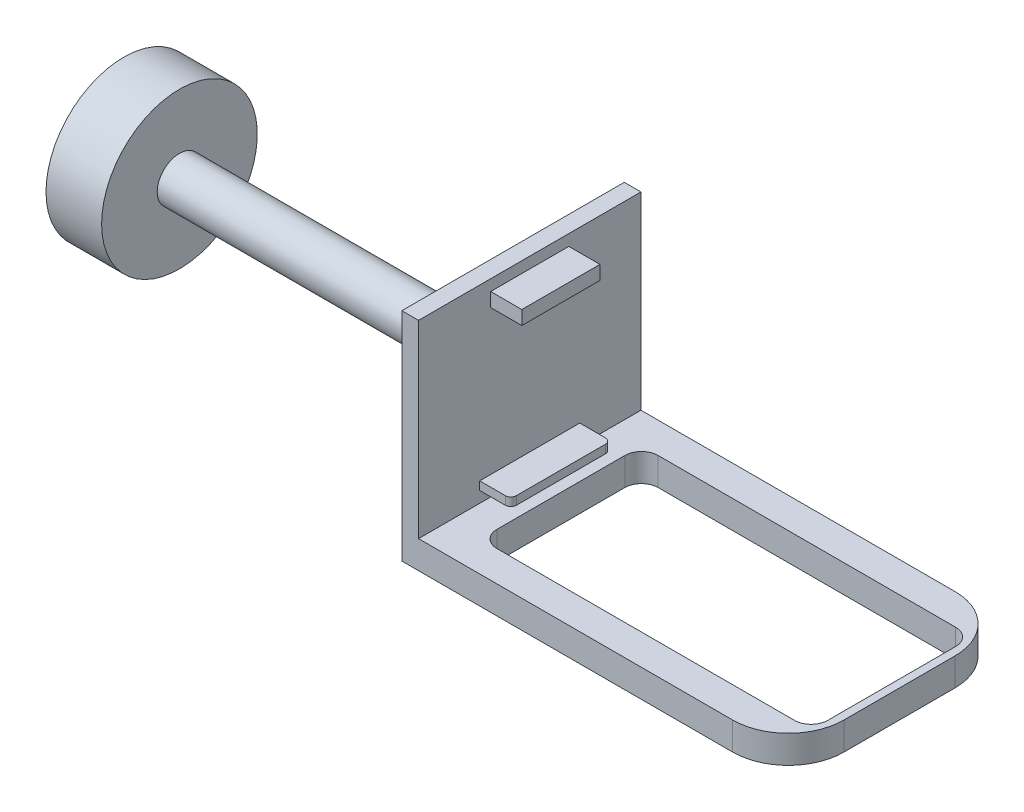
ISO-10303-21;
HEADER;
FILE_DESCRIPTION(('STEP AP214'),'2;1');
FILE_NAME('part.step','',(''),(''),'','','');
FILE_SCHEMA(('AUTOMOTIVE_DESIGN { 1 0 10303 214 1 1 1 1 }'));
ENDSEC;
DATA;
#1=APPLICATION_CONTEXT('core data for automotive mechanical design processes');
#2=APPLICATION_PROTOCOL_DEFINITION('international standard','automotive_design',2000,#1);
#3=PRODUCT_CONTEXT('',#1,'mechanical');
#4=PRODUCT('Part','Part','',(#3));
#5=PRODUCT_RELATED_PRODUCT_CATEGORY('part','',(#4));
#6=PRODUCT_DEFINITION_FORMATION('','',#4);
#7=PRODUCT_DEFINITION_CONTEXT('part definition',#1,'design');
#8=PRODUCT_DEFINITION('design','',#6,#7);
#9=PRODUCT_DEFINITION_SHAPE('','',#8);
#10=(LENGTH_UNIT() NAMED_UNIT(*) SI_UNIT(.MILLI.,.METRE.));
#11=(NAMED_UNIT(*) PLANE_ANGLE_UNIT() SI_UNIT($,.RADIAN.));
#12=(NAMED_UNIT(*) SI_UNIT($,.STERADIAN.) SOLID_ANGLE_UNIT());
#13=UNCERTAINTY_MEASURE_WITH_UNIT(LENGTH_MEASURE(1.E-05),#10,'distance_accuracy_value','');
#14=(GEOMETRIC_REPRESENTATION_CONTEXT(3) GLOBAL_UNCERTAINTY_ASSIGNED_CONTEXT((#13)) GLOBAL_UNIT_ASSIGNED_CONTEXT((#10,
#11,#12)) REPRESENTATION_CONTEXT('',''));
#15=CARTESIAN_POINT('',(0.,0.,0.));
#16=DIRECTION('',(0.,0.,1.));
#17=DIRECTION('',(1.,0.,0.));
#18=AXIS2_PLACEMENT_3D('',#15,#16,#17);
#19=CARTESIAN_POINT('',(-33.25,0.,0.));
#20=DIRECTION('',(-1.,0.,0.));
#21=DIRECTION('',(0.,0.,1.));
#22=AXIS2_PLACEMENT_3D('',#19,#20,#21);
#23=PLANE('',#22);
#24=DIRECTION('',(0.,-1.,0.));
#25=VECTOR('',#24,1.);
#26=CARTESIAN_POINT('',(-33.25,37.,7.025));
#27=LINE('',#26,#25);
#28=CARTESIAN_POINT('',(-33.25,37.,7.025));
#29=VERTEX_POINT('',#28);
#30=CARTESIAN_POINT('',(-33.25,34.5,7.025));
#31=VERTEX_POINT('',#30);
#32=EDGE_CURVE('E236',#29,#31,#27,.T.);
#33=ORIENTED_EDGE('',*,*,#32,.F.);
#34=DIRECTION('',(0.,0.,1.));
#35=VECTOR('',#34,1.);
#36=CARTESIAN_POINT('',(-33.25,37.,0.));
#37=LINE('',#36,#35);
#38=CARTESIAN_POINT('',(-33.25,37.,-7.025));
#39=VERTEX_POINT('',#38);
#40=EDGE_CURVE('E252',#39,#29,#37,.T.);
#41=ORIENTED_EDGE('',*,*,#40,.F.);
#42=DIRECTION('',(0.,1.,0.));
#43=VECTOR('',#42,1.);
#44=CARTESIAN_POINT('',(-33.25,34.5,-7.025));
#45=LINE('',#44,#43);
#46=CARTESIAN_POINT('',(-33.25,34.5,-7.025));
#47=VERTEX_POINT('',#46);
#48=EDGE_CURVE('E262',#47,#39,#45,.T.);
#49=ORIENTED_EDGE('',*,*,#48,.F.);
#50=DIRECTION('',(0.,0.,-1.));
#51=VECTOR('',#50,1.);
#52=CARTESIAN_POINT('',(-33.25,34.5,7.025));
#53=LINE('',#52,#51);
#54=EDGE_CURVE('E240',#31,#47,#53,.T.);
#55=ORIENTED_EDGE('',*,*,#54,.F.);
#56=EDGE_LOOP('',(#33,#41,#49,#55));
#57=FACE_BOUND('',#56,.T.);
#58=DIRECTION('',(0.,0.,1.));
#59=VECTOR('',#58,1.);
#60=CARTESIAN_POINT('',(-33.25,5.,20.));
#61=LINE('',#60,#59);
#62=CARTESIAN_POINT('',(-33.25,5.,-20.));
#63=VERTEX_POINT('',#62);
#64=CARTESIAN_POINT('',(-33.25,5.,20.));
#65=VERTEX_POINT('',#64);
#66=EDGE_CURVE('E367',#63,#65,#61,.T.);
#67=ORIENTED_EDGE('',*,*,#66,.F.);
#68=DIRECTION('',(0.,-1.,0.));
#69=VECTOR('',#68,1.);
#70=CARTESIAN_POINT('',(-33.25,0.,-20.));
#71=LINE('',#70,#69);
#72=CARTESIAN_POINT('',(-33.25,39.,-20.));
#73=VERTEX_POINT('',#72);
#74=EDGE_CURVE('E283',#73,#63,#71,.T.);
#75=ORIENTED_EDGE('',*,*,#74,.F.);
#76=DIRECTION('',(0.,0.,-1.));
#77=VECTOR('',#76,1.);
#78=CARTESIAN_POINT('',(-33.25,39.,20.));
#79=LINE('',#78,#77);
#80=CARTESIAN_POINT('',(-33.25,39.,20.));
#81=VERTEX_POINT('',#80);
#82=EDGE_CURVE('E293',#81,#73,#79,.T.);
#83=ORIENTED_EDGE('',*,*,#82,.F.);
#84=DIRECTION('',(0.,1.,0.));
#85=VECTOR('',#84,1.);
#86=CARTESIAN_POINT('',(-33.25,0.,20.));
#87=LINE('',#86,#85);
#88=EDGE_CURVE('E278',#65,#81,#87,.T.);
#89=ORIENTED_EDGE('',*,*,#88,.F.);
#90=EDGE_LOOP('',(#67,#75,#83,#89));
#91=FACE_BOUND('',#90,.T.);
#92=DIRECTION('',(0.,0.,-1.));
#93=VECTOR('',#92,1.);
#94=CARTESIAN_POINT('',(-33.25,7.,0.));
#95=LINE('',#94,#93);
#96=CARTESIAN_POINT('',(-33.25,7.,9.));
#97=VERTEX_POINT('',#96);
#98=CARTESIAN_POINT('',(-33.25,7.,-9.));
#99=VERTEX_POINT('',#98);
#100=EDGE_CURVE('E216',#97,#99,#95,.T.);
#101=ORIENTED_EDGE('',*,*,#100,.F.);
#102=DIRECTION('',(0.,-1.,0.));
#103=VECTOR('',#102,1.);
#104=CARTESIAN_POINT('',(-33.25,8.5,9.));
#105=LINE('',#104,#103);
#106=CARTESIAN_POINT('',(-33.25,8.5,9.));
#107=VERTEX_POINT('',#106);
#108=EDGE_CURVE('E228',#107,#97,#105,.T.);
#109=ORIENTED_EDGE('',*,*,#108,.F.);
#110=DIRECTION('',(0.,0.,1.));
#111=VECTOR('',#110,1.);
#112=CARTESIAN_POINT('',(-33.25,8.5,-9.));
#113=LINE('',#112,#111);
#114=CARTESIAN_POINT('',(-33.25,8.5,-9.));
#115=VERTEX_POINT('',#114);
#116=EDGE_CURVE('E237',#115,#107,#113,.T.);
#117=ORIENTED_EDGE('',*,*,#116,.F.);
#118=DIRECTION('',(0.,1.,0.));
#119=VECTOR('',#118,1.);
#120=CARTESIAN_POINT('',(-33.25,7.,-9.));
#121=LINE('',#120,#119);
#122=EDGE_CURVE('E231',#99,#115,#121,.T.);
#123=ORIENTED_EDGE('',*,*,#122,.F.);
#124=EDGE_LOOP('',(#101,#109,#117,#123));
#125=FACE_BOUND('',#124,.T.);
#126=ADVANCED_FACE('F35',(#57,#91,#125),#23,.F.);
#127=CARTESIAN_POINT('',(0.,5.,0.));
#128=DIRECTION('',(0.,-1.,0.));
#129=DIRECTION('',(0.,0.,-1.));
#130=AXIS2_PLACEMENT_3D('',#127,#128,#129);
#131=PLANE('',#130);
#132=DIRECTION('',(1.,0.,0.));
#133=VECTOR('',#132,1.);
#134=CARTESIAN_POINT('',(-33.25,5.,20.));
#135=LINE('',#134,#133);
#136=CARTESIAN_POINT('',(23.25,5.,20.));
#137=VERTEX_POINT('',#136);
#138=EDGE_CURVE('E370',#65,#137,#135,.T.);
#139=ORIENTED_EDGE('',*,*,#138,.T.);
#140=CARTESIAN_POINT('',(23.25,5.,10.));
#141=DIRECTION('',(0.,-1.,0.));
#142=DIRECTION('',(0.,0.,-1.));
#143=AXIS2_PLACEMENT_3D('',#140,#141,#142);
#144=CIRCLE('',#143,10.);
#145=CARTESIAN_POINT('',(33.25,5.,10.));
#146=VERTEX_POINT('',#145);
#147=EDGE_CURVE('E43',#137,#146,#144,.F.);
#148=ORIENTED_EDGE('',*,*,#147,.T.);
#149=DIRECTION('',(0.,0.,-1.));
#150=VECTOR('',#149,1.);
#151=CARTESIAN_POINT('',(33.25,5.,20.));
#152=LINE('',#151,#150);
#153=CARTESIAN_POINT('',(33.25,5.,-10.));
#154=VERTEX_POINT('',#153);
#155=EDGE_CURVE('E362',#146,#154,#152,.T.);
#156=ORIENTED_EDGE('',*,*,#155,.T.);
#157=CARTESIAN_POINT('',(23.25,5.,-10.));
#158=DIRECTION('',(0.,-1.,0.));
#159=DIRECTION('',(0.,0.,-1.));
#160=AXIS2_PLACEMENT_3D('',#157,#158,#159);
#161=CIRCLE('',#160,10.);
#162=CARTESIAN_POINT('',(23.25,5.,-20.));
#163=VERTEX_POINT('',#162);
#164=EDGE_CURVE('E50',#154,#163,#161,.F.);
#165=ORIENTED_EDGE('',*,*,#164,.T.);
#166=DIRECTION('',(-1.,0.,0.));
#167=VECTOR('',#166,1.);
#168=CARTESIAN_POINT('',(-33.25,5.,-20.));
#169=LINE('',#168,#167);
#170=EDGE_CURVE('E364',#163,#63,#169,.T.);
#171=ORIENTED_EDGE('',*,*,#170,.T.);
#172=ORIENTED_EDGE('',*,*,#66,.T.);
#173=EDGE_LOOP('',(#139,#148,#156,#165,#171,#172));
#174=FACE_BOUND('',#173,.T.);
#175=CARTESIAN_POINT('',(28.85,5.,11.5));
#176=DIRECTION('',(0.,1.,0.));
#177=DIRECTION('',(0.,0.,-1.));
#178=AXIS2_PLACEMENT_3D('',#175,#176,#177);
#179=CIRCLE('',#178,3.);
#180=CARTESIAN_POINT('',(28.85,5.,14.5));
#181=VERTEX_POINT('',#180);
#182=CARTESIAN_POINT('',(31.85,5.,11.5));
#183=VERTEX_POINT('',#182);
#184=EDGE_CURVE('E303',#181,#183,#179,.T.);
#185=ORIENTED_EDGE('',*,*,#184,.F.);
#186=DIRECTION('',(1.,0.,0.));
#187=VECTOR('',#186,1.);
#188=CARTESIAN_POINT('',(28.85,5.,14.5));
#189=LINE('',#188,#187);
#190=CARTESIAN_POINT('',(-24.65,5.,14.5));
#191=VERTEX_POINT('',#190);
#192=EDGE_CURVE('E319',#191,#181,#189,.T.);
#193=ORIENTED_EDGE('',*,*,#192,.F.);
#194=CARTESIAN_POINT('',(-24.65,5.,11.5));
#195=DIRECTION('',(0.,1.,0.));
#196=DIRECTION('',(0.,0.,1.));
#197=AXIS2_PLACEMENT_3D('',#194,#195,#196);
#198=CIRCLE('',#197,3.);
#199=CARTESIAN_POINT('',(-27.65,5.,11.5));
#200=VERTEX_POINT('',#199);
#201=EDGE_CURVE('E316',#200,#191,#198,.T.);
#202=ORIENTED_EDGE('',*,*,#201,.F.);
#203=DIRECTION('',(0.,0.,1.));
#204=VECTOR('',#203,1.);
#205=CARTESIAN_POINT('',(-27.65,5.,-11.5));
#206=LINE('',#205,#204);
#207=CARTESIAN_POINT('',(-27.65,5.,-11.5));
#208=VERTEX_POINT('',#207);
#209=EDGE_CURVE('E314',#208,#200,#206,.T.);
#210=ORIENTED_EDGE('',*,*,#209,.F.);
#211=CARTESIAN_POINT('',(-24.65,5.,-11.5));
#212=DIRECTION('',(0.,1.,0.));
#213=DIRECTION('',(0.,0.,-1.));
#214=AXIS2_PLACEMENT_3D('',#211,#212,#213);
#215=CIRCLE('',#214,3.);
#216=CARTESIAN_POINT('',(-24.65,5.,-14.5));
#217=VERTEX_POINT('',#216);
#218=EDGE_CURVE('E312',#217,#208,#215,.T.);
#219=ORIENTED_EDGE('',*,*,#218,.F.);
#220=DIRECTION('',(-1.,0.,0.));
#221=VECTOR('',#220,1.);
#222=CARTESIAN_POINT('',(-24.65,5.,-14.5));
#223=LINE('',#222,#221);
#224=CARTESIAN_POINT('',(28.85,5.,-14.5));
#225=VERTEX_POINT('',#224);
#226=EDGE_CURVE('E310',#225,#217,#223,.T.);
#227=ORIENTED_EDGE('',*,*,#226,.F.);
#228=CARTESIAN_POINT('',(28.85,5.,-11.5));
#229=DIRECTION('',(0.,1.,0.));
#230=DIRECTION('',(0.,0.,-1.));
#231=AXIS2_PLACEMENT_3D('',#228,#229,#230);
#232=CIRCLE('',#231,3.);
#233=CARTESIAN_POINT('',(31.85,5.,-11.5));
#234=VERTEX_POINT('',#233);
#235=EDGE_CURVE('E308',#234,#225,#232,.T.);
#236=ORIENTED_EDGE('',*,*,#235,.F.);
#237=DIRECTION('',(0.,0.,-1.));
#238=VECTOR('',#237,1.);
#239=CARTESIAN_POINT('',(31.85,5.,-11.5));
#240=LINE('',#239,#238);
#241=EDGE_CURVE('E305',#183,#234,#240,.T.);
#242=ORIENTED_EDGE('',*,*,#241,.F.);
#243=EDGE_LOOP('',(#185,#193,#202,#210,#219,#227,#236,#242));
#244=FACE_BOUND('',#243,.T.);
#245=ADVANCED_FACE('F406',(#174,#244),#131,.F.);
#246=CARTESIAN_POINT('',(0.,0.,0.));
#247=DIRECTION('',(0.,-1.,0.));
#248=DIRECTION('',(0.,0.,-1.));
#249=AXIS2_PLACEMENT_3D('',#246,#247,#248);
#250=PLANE('',#249);
#251=DIRECTION('',(0.,0.,-1.));
#252=VECTOR('',#251,1.);
#253=CARTESIAN_POINT('',(33.25,0.,20.));
#254=LINE('',#253,#252);
#255=CARTESIAN_POINT('',(33.25,0.,10.));
#256=VERTEX_POINT('',#255);
#257=CARTESIAN_POINT('',(33.25,0.,-10.));
#258=VERTEX_POINT('',#257);
#259=EDGE_CURVE('E361',#256,#258,#254,.T.);
#260=ORIENTED_EDGE('',*,*,#259,.F.);
#261=CARTESIAN_POINT('',(23.25,0.,10.));
#262=DIRECTION('',(0.,-1.,0.));
#263=DIRECTION('',(0.,0.,-1.));
#264=AXIS2_PLACEMENT_3D('',#261,#262,#263);
#265=CIRCLE('',#264,10.);
#266=CARTESIAN_POINT('',(23.25,0.,20.));
#267=VERTEX_POINT('',#266);
#268=EDGE_CURVE('E401',#256,#267,#265,.T.);
#269=ORIENTED_EDGE('',*,*,#268,.T.);
#270=DIRECTION('',(1.,0.,0.));
#271=VECTOR('',#270,1.);
#272=CARTESIAN_POINT('',(-33.25,0.,20.));
#273=LINE('',#272,#271);
#274=CARTESIAN_POINT('',(-36.25,0.,20.));
#275=VERTEX_POINT('',#274);
#276=EDGE_CURVE('E365',#275,#267,#273,.T.);
#277=ORIENTED_EDGE('',*,*,#276,.F.);
#278=DIRECTION('',(0.,0.,1.));
#279=VECTOR('',#278,1.);
#280=CARTESIAN_POINT('',(-36.25,0.,20.));
#281=LINE('',#280,#279);
#282=CARTESIAN_POINT('',(-36.25,0.,-20.));
#283=VERTEX_POINT('',#282);
#284=EDGE_CURVE('E288',#283,#275,#281,.T.);
#285=ORIENTED_EDGE('',*,*,#284,.F.);
#286=DIRECTION('',(-1.,0.,0.));
#287=VECTOR('',#286,1.);
#288=CARTESIAN_POINT('',(-33.25,0.,-20.));
#289=LINE('',#288,#287);
#290=CARTESIAN_POINT('',(23.25,0.,-20.));
#291=VERTEX_POINT('',#290);
#292=EDGE_CURVE('E375',#291,#283,#289,.T.);
#293=ORIENTED_EDGE('',*,*,#292,.F.);
#294=CARTESIAN_POINT('',(23.25,0.,-10.));
#295=DIRECTION('',(0.,-1.,0.));
#296=DIRECTION('',(0.,0.,-1.));
#297=AXIS2_PLACEMENT_3D('',#294,#295,#296);
#298=CIRCLE('',#297,10.);
#299=EDGE_CURVE('E399',#291,#258,#298,.T.);
#300=ORIENTED_EDGE('',*,*,#299,.T.);
#301=EDGE_LOOP('',(#260,#269,#277,#285,#293,#300));
#302=FACE_BOUND('',#301,.T.);
#303=DIRECTION('',(1.,0.,0.));
#304=VECTOR('',#303,1.);
#305=CARTESIAN_POINT('',(28.85,0.,14.5));
#306=LINE('',#305,#304);
#307=CARTESIAN_POINT('',(-24.65,0.,14.5));
#308=VERTEX_POINT('',#307);
#309=CARTESIAN_POINT('',(28.85,0.,14.5));
#310=VERTEX_POINT('',#309);
#311=EDGE_CURVE('E306',#308,#310,#306,.T.);
#312=ORIENTED_EDGE('',*,*,#311,.T.);
#313=CARTESIAN_POINT('',(28.85,0.,11.5));
#314=DIRECTION('',(0.,1.,0.));
#315=DIRECTION('',(0.,0.,-1.));
#316=AXIS2_PLACEMENT_3D('',#313,#314,#315);
#317=CIRCLE('',#316,3.);
#318=CARTESIAN_POINT('',(31.85,0.,11.5));
#319=VERTEX_POINT('',#318);
#320=EDGE_CURVE('E302',#310,#319,#317,.T.);
#321=ORIENTED_EDGE('',*,*,#320,.T.);
#322=DIRECTION('',(0.,0.,-1.));
#323=VECTOR('',#322,1.);
#324=CARTESIAN_POINT('',(31.85,0.,-11.5));
#325=LINE('',#324,#323);
#326=CARTESIAN_POINT('',(31.85,0.,-11.5));
#327=VERTEX_POINT('',#326);
#328=EDGE_CURVE('E324',#319,#327,#325,.T.);
#329=ORIENTED_EDGE('',*,*,#328,.T.);
#330=CARTESIAN_POINT('',(28.85,0.,-11.5));
#331=DIRECTION('',(0.,1.,0.));
#332=DIRECTION('',(0.,0.,-1.));
#333=AXIS2_PLACEMENT_3D('',#330,#331,#332);
#334=CIRCLE('',#333,3.);
#335=CARTESIAN_POINT('',(28.85,0.,-14.5));
#336=VERTEX_POINT('',#335);
#337=EDGE_CURVE('E327',#327,#336,#334,.T.);
#338=ORIENTED_EDGE('',*,*,#337,.T.);
#339=DIRECTION('',(-1.,0.,0.));
#340=VECTOR('',#339,1.);
#341=CARTESIAN_POINT('',(-24.65,0.,-14.5));
#342=LINE('',#341,#340);
#343=CARTESIAN_POINT('',(-24.65,0.,-14.5));
#344=VERTEX_POINT('',#343);
#345=EDGE_CURVE('E330',#336,#344,#342,.T.);
#346=ORIENTED_EDGE('',*,*,#345,.T.);
#347=CARTESIAN_POINT('',(-24.65,0.,-11.5));
#348=DIRECTION('',(0.,1.,0.));
#349=DIRECTION('',(0.,0.,-1.));
#350=AXIS2_PLACEMENT_3D('',#347,#348,#349);
#351=CIRCLE('',#350,3.);
#352=CARTESIAN_POINT('',(-27.65,0.,-11.5));
#353=VERTEX_POINT('',#352);
#354=EDGE_CURVE('E333',#344,#353,#351,.T.);
#355=ORIENTED_EDGE('',*,*,#354,.T.);
#356=DIRECTION('',(0.,0.,1.));
#357=VECTOR('',#356,1.);
#358=CARTESIAN_POINT('',(-27.65,0.,-11.5));
#359=LINE('',#358,#357);
#360=CARTESIAN_POINT('',(-27.65,0.,11.5));
#361=VERTEX_POINT('',#360);
#362=EDGE_CURVE('E336',#353,#361,#359,.T.);
#363=ORIENTED_EDGE('',*,*,#362,.T.);
#364=CARTESIAN_POINT('',(-24.65,0.,11.5));
#365=DIRECTION('',(0.,1.,0.));
#366=DIRECTION('',(0.,0.,1.));
#367=AXIS2_PLACEMENT_3D('',#364,#365,#366);
#368=CIRCLE('',#367,3.);
#369=EDGE_CURVE('E339',#361,#308,#368,.T.);
#370=ORIENTED_EDGE('',*,*,#369,.T.);
#371=EDGE_LOOP('',(#312,#321,#329,#338,#346,#355,#363,#370));
#372=FACE_BOUND('',#371,.T.);
#373=ADVANCED_FACE('F416',(#302,#372),#250,.T.);
#374=CARTESIAN_POINT('',(33.25,5.,20.));
#375=DIRECTION('',(-1.,0.,0.));
#376=DIRECTION('',(0.,0.,1.));
#377=AXIS2_PLACEMENT_3D('',#374,#375,#376);
#378=PLANE('',#377);
#379=ORIENTED_EDGE('',*,*,#155,.F.);
#380=DIRECTION('',(0.,-1.,0.));
#381=VECTOR('',#380,1.);
#382=CARTESIAN_POINT('',(33.25,5.,10.));
#383=LINE('',#382,#381);
#384=EDGE_CURVE('E396',#146,#256,#383,.T.);
#385=ORIENTED_EDGE('',*,*,#384,.T.);
#386=ORIENTED_EDGE('',*,*,#259,.T.);
#387=DIRECTION('',(0.,-1.,0.));
#388=VECTOR('',#387,1.);
#389=CARTESIAN_POINT('',(33.25,5.,-10.));
#390=LINE('',#389,#388);
#391=EDGE_CURVE('E394',#258,#154,#390,.F.);
#392=ORIENTED_EDGE('',*,*,#391,.T.);
#393=EDGE_LOOP('',(#379,#385,#386,#392));
#394=FACE_BOUND('',#393,.T.);
#395=ADVANCED_FACE('F411',(#394),#378,.F.);
#396=CARTESIAN_POINT('',(-33.25,5.,-20.));
#397=DIRECTION('',(0.,0.,1.));
#398=DIRECTION('',(1.,0.,0.));
#399=AXIS2_PLACEMENT_3D('',#396,#397,#398);
#400=PLANE('',#399);
#401=ORIENTED_EDGE('',*,*,#170,.F.);
#402=DIRECTION('',(0.,-1.,0.));
#403=VECTOR('',#402,1.);
#404=CARTESIAN_POINT('',(23.25,5.,-20.));
#405=LINE('',#404,#403);
#406=EDGE_CURVE('E11',#163,#291,#405,.T.);
#407=ORIENTED_EDGE('',*,*,#406,.T.);
#408=ORIENTED_EDGE('',*,*,#292,.T.);
#409=DIRECTION('',(0.,-1.,0.));
#410=VECTOR('',#409,1.);
#411=CARTESIAN_POINT('',(-36.25,0.,-20.));
#412=LINE('',#411,#410);
#413=CARTESIAN_POINT('',(-36.25,39.,-20.));
#414=VERTEX_POINT('',#413);
#415=EDGE_CURVE('E285',#414,#283,#412,.T.);
#416=ORIENTED_EDGE('',*,*,#415,.F.);
#417=DIRECTION('',(1.,0.,0.));
#418=VECTOR('',#417,1.);
#419=CARTESIAN_POINT('',(-36.25,39.,-20.));
#420=LINE('',#419,#418);
#421=EDGE_CURVE('E291',#414,#73,#420,.T.);
#422=ORIENTED_EDGE('',*,*,#421,.T.);
#423=ORIENTED_EDGE('',*,*,#74,.T.);
#424=EDGE_LOOP('',(#401,#407,#408,#416,#422,#423));
#425=FACE_BOUND('',#424,.T.);
#426=ADVANCED_FACE('F428',(#425),#400,.F.);
#427=CARTESIAN_POINT('',(-33.25,5.,20.));
#428=DIRECTION('',(0.,0.,-1.));
#429=DIRECTION('',(-1.,0.,0.));
#430=AXIS2_PLACEMENT_3D('',#427,#428,#429);
#431=PLANE('',#430);
#432=ORIENTED_EDGE('',*,*,#276,.T.);
#433=DIRECTION('',(0.,-1.,0.));
#434=VECTOR('',#433,1.);
#435=CARTESIAN_POINT('',(23.25,5.,20.));
#436=LINE('',#435,#434);
#437=EDGE_CURVE('E58',#267,#137,#436,.F.);
#438=ORIENTED_EDGE('',*,*,#437,.T.);
#439=ORIENTED_EDGE('',*,*,#138,.F.);
#440=ORIENTED_EDGE('',*,*,#88,.T.);
#441=DIRECTION('',(1.,0.,0.));
#442=VECTOR('',#441,1.);
#443=CARTESIAN_POINT('',(-36.25,39.,20.));
#444=LINE('',#443,#442);
#445=CARTESIAN_POINT('',(-36.25,39.,20.));
#446=VERTEX_POINT('',#445);
#447=EDGE_CURVE('E299',#446,#81,#444,.T.);
#448=ORIENTED_EDGE('',*,*,#447,.F.);
#449=DIRECTION('',(0.,1.,0.));
#450=VECTOR('',#449,1.);
#451=CARTESIAN_POINT('',(-36.25,0.,20.));
#452=LINE('',#451,#450);
#453=EDGE_CURVE('E279',#275,#446,#452,.T.);
#454=ORIENTED_EDGE('',*,*,#453,.F.);
#455=EDGE_LOOP('',(#432,#438,#439,#440,#448,#454));
#456=FACE_BOUND('',#455,.T.);
#457=ADVANCED_FACE('F420',(#456),#431,.F.);
#458=CARTESIAN_POINT('',(28.85,5.,11.5));
#459=DIRECTION('',(0.,-1.,0.));
#460=DIRECTION('',(0.,0.,-1.));
#461=AXIS2_PLACEMENT_3D('',#458,#459,#460);
#462=CYLINDRICAL_SURFACE('',#461,3.);
#463=ORIENTED_EDGE('',*,*,#320,.F.);
#464=DIRECTION('',(0.,-1.,0.));
#465=VECTOR('',#464,1.);
#466=CARTESIAN_POINT('',(28.85,5.,14.5));
#467=LINE('',#466,#465);
#468=EDGE_CURVE('E321',#181,#310,#467,.T.);
#469=ORIENTED_EDGE('',*,*,#468,.F.);
#470=ORIENTED_EDGE('',*,*,#184,.T.);
#471=DIRECTION('',(0.,-1.,0.));
#472=VECTOR('',#471,1.);
#473=CARTESIAN_POINT('',(31.85,5.,11.5));
#474=LINE('',#473,#472);
#475=EDGE_CURVE('E358',#183,#319,#474,.T.);
#476=ORIENTED_EDGE('',*,*,#475,.T.);
#477=EDGE_LOOP('',(#463,#469,#470,#476));
#478=FACE_BOUND('',#477,.T.);
#479=ADVANCED_FACE('F484',(#478),#462,.F.);
#480=CARTESIAN_POINT('',(31.85,5.,-11.5));
#481=DIRECTION('',(-1.,0.,0.));
#482=DIRECTION('',(0.,0.,1.));
#483=AXIS2_PLACEMENT_3D('',#480,#481,#482);
#484=PLANE('',#483);
#485=ORIENTED_EDGE('',*,*,#328,.F.);
#486=ORIENTED_EDGE('',*,*,#475,.F.);
#487=ORIENTED_EDGE('',*,*,#241,.T.);
#488=DIRECTION('',(0.,-1.,0.));
#489=VECTOR('',#488,1.);
#490=CARTESIAN_POINT('',(31.85,5.,-11.5));
#491=LINE('',#490,#489);
#492=EDGE_CURVE('E356',#234,#327,#491,.T.);
#493=ORIENTED_EDGE('',*,*,#492,.T.);
#494=EDGE_LOOP('',(#485,#486,#487,#493));
#495=FACE_BOUND('',#494,.T.);
#496=ADVANCED_FACE('F480',(#495),#484,.T.);
#497=CARTESIAN_POINT('',(28.85,5.,-11.5));
#498=DIRECTION('',(0.,-1.,0.));
#499=DIRECTION('',(0.,0.,-1.));
#500=AXIS2_PLACEMENT_3D('',#497,#498,#499);
#501=CYLINDRICAL_SURFACE('',#500,3.);
#502=ORIENTED_EDGE('',*,*,#337,.F.);
#503=ORIENTED_EDGE('',*,*,#492,.F.);
#504=ORIENTED_EDGE('',*,*,#235,.T.);
#505=DIRECTION('',(0.,-1.,0.));
#506=VECTOR('',#505,1.);
#507=CARTESIAN_POINT('',(28.85,5.,-14.5));
#508=LINE('',#507,#506);
#509=EDGE_CURVE('E354',#225,#336,#508,.T.);
#510=ORIENTED_EDGE('',*,*,#509,.T.);
#511=EDGE_LOOP('',(#502,#503,#504,#510));
#512=FACE_BOUND('',#511,.T.);
#513=ADVANCED_FACE('F476',(#512),#501,.F.);
#514=CARTESIAN_POINT('',(-24.65,5.,-14.5));
#515=DIRECTION('',(0.,0.,1.));
#516=DIRECTION('',(1.,0.,0.));
#517=AXIS2_PLACEMENT_3D('',#514,#515,#516);
#518=PLANE('',#517);
#519=ORIENTED_EDGE('',*,*,#345,.F.);
#520=ORIENTED_EDGE('',*,*,#509,.F.);
#521=ORIENTED_EDGE('',*,*,#226,.T.);
#522=DIRECTION('',(0.,-1.,0.));
#523=VECTOR('',#522,1.);
#524=CARTESIAN_POINT('',(-24.65,5.,-14.5));
#525=LINE('',#524,#523);
#526=EDGE_CURVE('E352',#217,#344,#525,.T.);
#527=ORIENTED_EDGE('',*,*,#526,.T.);
#528=EDGE_LOOP('',(#519,#520,#521,#527));
#529=FACE_BOUND('',#528,.T.);
#530=ADVANCED_FACE('F472',(#529),#518,.T.);
#531=CARTESIAN_POINT('',(-24.65,5.,-11.5));
#532=DIRECTION('',(0.,-1.,0.));
#533=DIRECTION('',(0.,0.,-1.));
#534=AXIS2_PLACEMENT_3D('',#531,#532,#533);
#535=CYLINDRICAL_SURFACE('',#534,3.);
#536=ORIENTED_EDGE('',*,*,#354,.F.);
#537=ORIENTED_EDGE('',*,*,#526,.F.);
#538=ORIENTED_EDGE('',*,*,#218,.T.);
#539=DIRECTION('',(0.,-1.,0.));
#540=VECTOR('',#539,1.);
#541=CARTESIAN_POINT('',(-27.65,5.,-11.5));
#542=LINE('',#541,#540);
#543=EDGE_CURVE('E350',#208,#353,#542,.T.);
#544=ORIENTED_EDGE('',*,*,#543,.T.);
#545=EDGE_LOOP('',(#536,#537,#538,#544));
#546=FACE_BOUND('',#545,.T.);
#547=ADVANCED_FACE('F468',(#546),#535,.F.);
#548=CARTESIAN_POINT('',(-27.65,5.,-11.5));
#549=DIRECTION('',(1.,0.,0.));
#550=DIRECTION('',(0.,0.,-1.));
#551=AXIS2_PLACEMENT_3D('',#548,#549,#550);
#552=PLANE('',#551);
#553=ORIENTED_EDGE('',*,*,#362,.F.);
#554=ORIENTED_EDGE('',*,*,#543,.F.);
#555=ORIENTED_EDGE('',*,*,#209,.T.);
#556=DIRECTION('',(0.,-1.,0.));
#557=VECTOR('',#556,1.);
#558=CARTESIAN_POINT('',(-27.65,5.,11.5));
#559=LINE('',#558,#557);
#560=EDGE_CURVE('E348',#200,#361,#559,.T.);
#561=ORIENTED_EDGE('',*,*,#560,.T.);
#562=EDGE_LOOP('',(#553,#554,#555,#561));
#563=FACE_BOUND('',#562,.T.);
#564=ADVANCED_FACE('F464',(#563),#552,.T.);
#565=CARTESIAN_POINT('',(-24.65,5.,11.5));
#566=DIRECTION('',(0.,-1.,0.));
#567=DIRECTION('',(0.,0.,-1.));
#568=AXIS2_PLACEMENT_3D('',#565,#566,#567);
#569=CYLINDRICAL_SURFACE('',#568,3.);
#570=ORIENTED_EDGE('',*,*,#369,.F.);
#571=ORIENTED_EDGE('',*,*,#560,.F.);
#572=ORIENTED_EDGE('',*,*,#201,.T.);
#573=DIRECTION('',(0.,-1.,0.));
#574=VECTOR('',#573,1.);
#575=CARTESIAN_POINT('',(-24.65,5.,14.5));
#576=LINE('',#575,#574);
#577=EDGE_CURVE('E346',#191,#308,#576,.T.);
#578=ORIENTED_EDGE('',*,*,#577,.T.);
#579=EDGE_LOOP('',(#570,#571,#572,#578));
#580=FACE_BOUND('',#579,.T.);
#581=ADVANCED_FACE('F460',(#580),#569,.F.);
#582=CARTESIAN_POINT('',(28.85,5.,14.5));
#583=DIRECTION('',(0.,0.,-1.));
#584=DIRECTION('',(-1.,0.,0.));
#585=AXIS2_PLACEMENT_3D('',#582,#583,#584);
#586=PLANE('',#585);
#587=ORIENTED_EDGE('',*,*,#311,.F.);
#588=ORIENTED_EDGE('',*,*,#577,.F.);
#589=ORIENTED_EDGE('',*,*,#192,.T.);
#590=ORIENTED_EDGE('',*,*,#468,.T.);
#591=EDGE_LOOP('',(#587,#588,#589,#590));
#592=FACE_BOUND('',#591,.T.);
#593=ADVANCED_FACE('F456',(#592),#586,.T.);
#594=CARTESIAN_POINT('',(-36.25,39.,20.));
#595=DIRECTION('',(0.,-1.,0.));
#596=DIRECTION('',(0.,0.,-1.));
#597=AXIS2_PLACEMENT_3D('',#594,#595,#596);
#598=PLANE('',#597);
#599=ORIENTED_EDGE('',*,*,#82,.T.);
#600=ORIENTED_EDGE('',*,*,#421,.F.);
#601=DIRECTION('',(0.,0.,-1.));
#602=VECTOR('',#601,1.);
#603=CARTESIAN_POINT('',(-36.25,39.,20.));
#604=LINE('',#603,#602);
#605=EDGE_CURVE('E282',#446,#414,#604,.T.);
#606=ORIENTED_EDGE('',*,*,#605,.F.);
#607=ORIENTED_EDGE('',*,*,#447,.T.);
#608=EDGE_LOOP('',(#599,#600,#606,#607));
#609=FACE_BOUND('',#608,.T.);
#610=ADVANCED_FACE('F453',(#609),#598,.F.);
#611=CARTESIAN_POINT('',(-36.25,0.,0.));
#612=DIRECTION('',(-1.,0.,0.));
#613=DIRECTION('',(0.,0.,1.));
#614=AXIS2_PLACEMENT_3D('',#611,#612,#613);
#615=PLANE('',#614);
#616=CARTESIAN_POINT('',(-36.25,19.5,0.));
#617=DIRECTION('',(-1.,0.,0.));
#618=DIRECTION('',(0.,0.,1.));
#619=AXIS2_PLACEMENT_3D('',#616,#617,#618);
#620=CIRCLE('',#619,4.);
#621=CARTESIAN_POINT('',(-36.25,19.5,4.));
#622=VERTEX_POINT('',#621);
#623=EDGE_CURVE('E575',#622,#622,#620,.T.);
#624=ORIENTED_EDGE('',*,*,#623,.F.);
#625=EDGE_LOOP('',(#624));
#626=FACE_BOUND('',#625,.T.);
#627=ORIENTED_EDGE('',*,*,#453,.T.);
#628=ORIENTED_EDGE('',*,*,#605,.T.);
#629=ORIENTED_EDGE('',*,*,#415,.T.);
#630=ORIENTED_EDGE('',*,*,#284,.T.);
#631=EDGE_LOOP('',(#627,#628,#629,#630));
#632=FACE_BOUND('',#631,.T.);
#633=ADVANCED_FACE('F423',(#626,#632),#615,.T.);
#634=CARTESIAN_POINT('',(-27.65,37.,7.025));
#635=DIRECTION('',(0.,0.,-1.));
#636=DIRECTION('',(-1.,0.,0.));
#637=AXIS2_PLACEMENT_3D('',#634,#635,#636);
#638=PLANE('',#637);
#639=ORIENTED_EDGE('',*,*,#32,.T.);
#640=DIRECTION('',(-1.,0.,0.));
#641=VECTOR('',#640,1.);
#642=CARTESIAN_POINT('',(-27.65,34.5,7.025));
#643=LINE('',#642,#641);
#644=CARTESIAN_POINT('',(-27.65,34.5,7.025));
#645=VERTEX_POINT('',#644);
#646=EDGE_CURVE('E275',#645,#31,#643,.T.);
#647=ORIENTED_EDGE('',*,*,#646,.F.);
#648=DIRECTION('',(0.,-1.,0.));
#649=VECTOR('',#648,1.);
#650=CARTESIAN_POINT('',(-27.65,37.,7.025));
#651=LINE('',#650,#649);
#652=CARTESIAN_POINT('',(-27.65,37.,7.025));
#653=VERTEX_POINT('',#652);
#654=EDGE_CURVE('E248',#653,#645,#651,.T.);
#655=ORIENTED_EDGE('',*,*,#654,.F.);
#656=DIRECTION('',(-1.,0.,0.));
#657=VECTOR('',#656,1.);
#658=CARTESIAN_POINT('',(-27.65,37.,7.025));
#659=LINE('',#658,#657);
#660=EDGE_CURVE('E258',#653,#29,#659,.T.);
#661=ORIENTED_EDGE('',*,*,#660,.T.);
#662=EDGE_LOOP('',(#639,#647,#655,#661));
#663=FACE_BOUND('',#662,.T.);
#664=ADVANCED_FACE('F556',(#663),#638,.F.);
#665=CARTESIAN_POINT('',(-27.65,34.5,7.025));
#666=DIRECTION('',(0.,1.,0.));
#667=DIRECTION('',(0.,0.,1.));
#668=AXIS2_PLACEMENT_3D('',#665,#666,#667);
#669=PLANE('',#668);
#670=ORIENTED_EDGE('',*,*,#54,.T.);
#671=DIRECTION('',(-1.,0.,0.));
#672=VECTOR('',#671,1.);
#673=CARTESIAN_POINT('',(-27.65,34.5,-7.025));
#674=LINE('',#673,#672);
#675=CARTESIAN_POINT('',(-27.65,34.5,-7.025));
#676=VERTEX_POINT('',#675);
#677=EDGE_CURVE('E272',#676,#47,#674,.T.);
#678=ORIENTED_EDGE('',*,*,#677,.F.);
#679=DIRECTION('',(0.,0.,-1.));
#680=VECTOR('',#679,1.);
#681=CARTESIAN_POINT('',(-27.65,34.5,7.025));
#682=LINE('',#681,#680);
#683=EDGE_CURVE('E251',#645,#676,#682,.T.);
#684=ORIENTED_EDGE('',*,*,#683,.F.);
#685=ORIENTED_EDGE('',*,*,#646,.T.);
#686=EDGE_LOOP('',(#670,#678,#684,#685));
#687=FACE_BOUND('',#686,.T.);
#688=ADVANCED_FACE('F553',(#687),#669,.F.);
#689=CARTESIAN_POINT('',(-27.65,34.5,-7.025));
#690=DIRECTION('',(0.,0.,1.));
#691=DIRECTION('',(1.,0.,0.));
#692=AXIS2_PLACEMENT_3D('',#689,#690,#691);
#693=PLANE('',#692);
#694=ORIENTED_EDGE('',*,*,#48,.T.);
#695=DIRECTION('',(-1.,0.,0.));
#696=VECTOR('',#695,1.);
#697=CARTESIAN_POINT('',(-27.65,37.,-7.025));
#698=LINE('',#697,#696);
#699=CARTESIAN_POINT('',(-27.65,37.,-7.025));
#700=VERTEX_POINT('',#699);
#701=EDGE_CURVE('E269',#700,#39,#698,.T.);
#702=ORIENTED_EDGE('',*,*,#701,.F.);
#703=DIRECTION('',(0.,1.,0.));
#704=VECTOR('',#703,1.);
#705=CARTESIAN_POINT('',(-27.65,34.5,-7.025));
#706=LINE('',#705,#704);
#707=EDGE_CURVE('E254',#676,#700,#706,.T.);
#708=ORIENTED_EDGE('',*,*,#707,.F.);
#709=ORIENTED_EDGE('',*,*,#677,.T.);
#710=EDGE_LOOP('',(#694,#702,#708,#709));
#711=FACE_BOUND('',#710,.T.);
#712=ADVANCED_FACE('F549',(#711),#693,.F.);
#713=CARTESIAN_POINT('',(-27.65,37.,0.));
#714=DIRECTION('',(0.,-1.,0.));
#715=DIRECTION('',(0.,0.,-1.));
#716=AXIS2_PLACEMENT_3D('',#713,#714,#715);
#717=PLANE('',#716);
#718=ORIENTED_EDGE('',*,*,#40,.T.);
#719=ORIENTED_EDGE('',*,*,#660,.F.);
#720=DIRECTION('',(0.,0.,-1.));
#721=VECTOR('',#720,1.);
#722=CARTESIAN_POINT('',(-27.65,37.,0.));
#723=LINE('',#722,#721);
#724=EDGE_CURVE('E256',#653,#700,#723,.T.);
#725=ORIENTED_EDGE('',*,*,#724,.T.);
#726=ORIENTED_EDGE('',*,*,#701,.T.);
#727=EDGE_LOOP('',(#718,#719,#725,#726));
#728=FACE_BOUND('',#727,.T.);
#729=ADVANCED_FACE('F545',(#728),#717,.F.);
#730=CARTESIAN_POINT('',(-27.65,0.,0.));
#731=DIRECTION('',(1.,0.,0.));
#732=DIRECTION('',(0.,0.,-1.));
#733=AXIS2_PLACEMENT_3D('',#730,#731,#732);
#734=PLANE('',#733);
#735=ORIENTED_EDGE('',*,*,#654,.T.);
#736=ORIENTED_EDGE('',*,*,#683,.T.);
#737=ORIENTED_EDGE('',*,*,#707,.T.);
#738=ORIENTED_EDGE('',*,*,#724,.F.);
#739=EDGE_LOOP('',(#735,#736,#737,#738));
#740=FACE_BOUND('',#739,.T.);
#741=ADVANCED_FACE('F537',(#740),#734,.T.);
#742=CARTESIAN_POINT('',(-27.65,7.,0.));
#743=DIRECTION('',(0.,1.,0.));
#744=DIRECTION('',(0.,0.,1.));
#745=AXIS2_PLACEMENT_3D('',#742,#743,#744);
#746=PLANE('',#745);
#747=DIRECTION('',(0.,0.,1.));
#748=VECTOR('',#747,1.);
#749=CARTESIAN_POINT('',(-27.65,7.,0.));
#750=LINE('',#749,#748);
#751=CARTESIAN_POINT('',(-27.65,7.00000000000001,-8.));
#752=VERTEX_POINT('',#751);
#753=CARTESIAN_POINT('',(-27.65,7.,8.));
#754=VERTEX_POINT('',#753);
#755=EDGE_CURVE('E232',#752,#754,#750,.T.);
#756=ORIENTED_EDGE('',*,*,#755,.T.);
#757=CARTESIAN_POINT('',(-28.65,7.,8.));
#758=DIRECTION('',(0.,1.,0.));
#759=DIRECTION('',(0.,0.,1.));
#760=AXIS2_PLACEMENT_3D('',#757,#758,#759);
#761=CIRCLE('',#760,1.);
#762=CARTESIAN_POINT('',(-28.65,7.,9.));
#763=VERTEX_POINT('',#762);
#764=EDGE_CURVE('E217',#754,#763,#761,.F.);
#765=ORIENTED_EDGE('',*,*,#764,.T.);
#766=DIRECTION('',(-1.,0.,0.));
#767=VECTOR('',#766,1.);
#768=CARTESIAN_POINT('',(-27.65,7.,9.));
#769=LINE('',#768,#767);
#770=EDGE_CURVE('E211',#763,#97,#769,.T.);
#771=ORIENTED_EDGE('',*,*,#770,.T.);
#772=ORIENTED_EDGE('',*,*,#100,.T.);
#773=DIRECTION('',(-1.,0.,0.));
#774=VECTOR('',#773,1.);
#775=CARTESIAN_POINT('',(-27.65,7.,-9.));
#776=LINE('',#775,#774);
#777=CARTESIAN_POINT('',(-28.65,7.,-9.));
#778=VERTEX_POINT('',#777);
#779=EDGE_CURVE('E514',#778,#99,#776,.T.);
#780=ORIENTED_EDGE('',*,*,#779,.F.);
#781=CARTESIAN_POINT('',(-28.65,7.,-8.));
#782=DIRECTION('',(0.,1.,0.));
#783=DIRECTION('',(0.,0.,1.));
#784=AXIS2_PLACEMENT_3D('',#781,#782,#783);
#785=CIRCLE('',#784,1.);
#786=EDGE_CURVE('E383',#778,#752,#785,.F.);
#787=ORIENTED_EDGE('',*,*,#786,.T.);
#788=EDGE_LOOP('',(#756,#765,#771,#772,#780,#787));
#789=FACE_BOUND('',#788,.T.);
#790=ADVANCED_FACE('F214',(#789),#746,.F.);
#791=CARTESIAN_POINT('',(-27.65,7.,-9.));
#792=DIRECTION('',(0.,0.,1.));
#793=DIRECTION('',(1.,0.,0.));
#794=AXIS2_PLACEMENT_3D('',#791,#792,#793);
#795=PLANE('',#794);
#796=DIRECTION('',(-1.,0.,0.));
#797=VECTOR('',#796,1.);
#798=CARTESIAN_POINT('',(-27.65,8.5,-9.));
#799=LINE('',#798,#797);
#800=CARTESIAN_POINT('',(-28.65,8.5,-9.));
#801=VERTEX_POINT('',#800);
#802=EDGE_CURVE('E521',#801,#115,#799,.T.);
#803=ORIENTED_EDGE('',*,*,#802,.F.);
#804=DIRECTION('',(0.,1.,0.));
#805=VECTOR('',#804,1.);
#806=CARTESIAN_POINT('',(-28.65,7.,-9.));
#807=LINE('',#806,#805);
#808=EDGE_CURVE('E392',#801,#778,#807,.F.);
#809=ORIENTED_EDGE('',*,*,#808,.T.);
#810=ORIENTED_EDGE('',*,*,#779,.T.);
#811=ORIENTED_EDGE('',*,*,#122,.T.);
#812=EDGE_LOOP('',(#803,#809,#810,#811));
#813=FACE_BOUND('',#812,.T.);
#814=ADVANCED_FACE('F529',(#813),#795,.F.);
#815=CARTESIAN_POINT('',(-27.65,8.5,-9.));
#816=DIRECTION('',(0.,-1.,0.));
#817=DIRECTION('',(0.,0.,-1.));
#818=AXIS2_PLACEMENT_3D('',#815,#816,#817);
#819=PLANE('',#818);
#820=DIRECTION('',(-1.,0.,0.));
#821=VECTOR('',#820,1.);
#822=CARTESIAN_POINT('',(-27.65,8.5,9.));
#823=LINE('',#822,#821);
#824=CARTESIAN_POINT('',(-28.65,8.5,9.));
#825=VERTEX_POINT('',#824);
#826=EDGE_CURVE('E222',#825,#107,#823,.T.);
#827=ORIENTED_EDGE('',*,*,#826,.F.);
#828=CARTESIAN_POINT('',(-28.65,8.5,8.));
#829=DIRECTION('',(0.,-1.,0.));
#830=DIRECTION('',(0.,0.,-1.));
#831=AXIS2_PLACEMENT_3D('',#828,#829,#830);
#832=CIRCLE('',#831,1.);
#833=CARTESIAN_POINT('',(-27.65,8.5,8.));
#834=VERTEX_POINT('',#833);
#835=EDGE_CURVE('E390',#825,#834,#832,.F.);
#836=ORIENTED_EDGE('',*,*,#835,.T.);
#837=DIRECTION('',(0.,0.,1.));
#838=VECTOR('',#837,1.);
#839=CARTESIAN_POINT('',(-27.65,8.5,-9.));
#840=LINE('',#839,#838);
#841=CARTESIAN_POINT('',(-27.65,8.5,-8.));
#842=VERTEX_POINT('',#841);
#843=EDGE_CURVE('E221',#842,#834,#840,.T.);
#844=ORIENTED_EDGE('',*,*,#843,.F.);
#845=CARTESIAN_POINT('',(-28.65,8.5,-8.));
#846=DIRECTION('',(0.,-1.,0.));
#847=DIRECTION('',(0.,0.,-1.));
#848=AXIS2_PLACEMENT_3D('',#845,#846,#847);
#849=CIRCLE('',#848,1.);
#850=EDGE_CURVE('E388',#842,#801,#849,.F.);
#851=ORIENTED_EDGE('',*,*,#850,.T.);
#852=ORIENTED_EDGE('',*,*,#802,.T.);
#853=ORIENTED_EDGE('',*,*,#116,.T.);
#854=EDGE_LOOP('',(#827,#836,#844,#851,#852,#853));
#855=FACE_BOUND('',#854,.T.);
#856=ADVANCED_FACE('F520',(#855),#819,.F.);
#857=CARTESIAN_POINT('',(-27.65,8.5,9.));
#858=DIRECTION('',(0.,0.,-1.));
#859=DIRECTION('',(-1.,0.,0.));
#860=AXIS2_PLACEMENT_3D('',#857,#858,#859);
#861=PLANE('',#860);
#862=ORIENTED_EDGE('',*,*,#770,.F.);
#863=DIRECTION('',(0.,-1.,0.));
#864=VECTOR('',#863,1.);
#865=CARTESIAN_POINT('',(-28.65,8.5,9.));
#866=LINE('',#865,#864);
#867=EDGE_CURVE('E386',#763,#825,#866,.F.);
#868=ORIENTED_EDGE('',*,*,#867,.T.);
#869=ORIENTED_EDGE('',*,*,#826,.T.);
#870=ORIENTED_EDGE('',*,*,#108,.T.);
#871=EDGE_LOOP('',(#862,#868,#869,#870));
#872=FACE_BOUND('',#871,.T.);
#873=ADVANCED_FACE('F234',(#872),#861,.F.);
#874=CARTESIAN_POINT('',(-27.65,0.,0.));
#875=DIRECTION('',(1.,0.,0.));
#876=DIRECTION('',(0.,0.,-1.));
#877=AXIS2_PLACEMENT_3D('',#874,#875,#876);
#878=PLANE('',#877);
#879=ORIENTED_EDGE('',*,*,#843,.T.);
#880=DIRECTION('',(0.,-1.,0.));
#881=VECTOR('',#880,1.);
#882=CARTESIAN_POINT('',(-27.65,7.,8.));
#883=LINE('',#882,#881);
#884=EDGE_CURVE('E380',#834,#754,#883,.T.);
#885=ORIENTED_EDGE('',*,*,#884,.T.);
#886=ORIENTED_EDGE('',*,*,#755,.F.);
#887=DIRECTION('',(0.,1.,0.));
#888=VECTOR('',#887,1.);
#889=CARTESIAN_POINT('',(-27.65,8.5,-8.));
#890=LINE('',#889,#888);
#891=EDGE_CURVE('E372',#752,#842,#890,.T.);
#892=ORIENTED_EDGE('',*,*,#891,.T.);
#893=EDGE_LOOP('',(#879,#885,#886,#892));
#894=FACE_BOUND('',#893,.T.);
#895=ADVANCED_FACE('F501',(#894),#878,.T.);
#896=CARTESIAN_POINT('',(-28.65,0.,8.));
#897=DIRECTION('',(0.,1.,0.));
#898=DIRECTION('',(0.,0.,1.));
#899=AXIS2_PLACEMENT_3D('',#896,#897,#898);
#900=CYLINDRICAL_SURFACE('',#899,1.);
#901=ORIENTED_EDGE('',*,*,#835,.F.);
#902=ORIENTED_EDGE('',*,*,#867,.F.);
#903=ORIENTED_EDGE('',*,*,#764,.F.);
#904=ORIENTED_EDGE('',*,*,#884,.F.);
#905=EDGE_LOOP('',(#901,#902,#903,#904));
#906=FACE_BOUND('',#905,.T.);
#907=ADVANCED_FACE('F497',(#906),#900,.T.);
#908=CARTESIAN_POINT('',(-28.65,0.,-8.));
#909=DIRECTION('',(0.,-1.,0.));
#910=DIRECTION('',(0.,0.,-1.));
#911=AXIS2_PLACEMENT_3D('',#908,#909,#910);
#912=CYLINDRICAL_SURFACE('',#911,1.);
#913=ORIENTED_EDGE('',*,*,#786,.F.);
#914=ORIENTED_EDGE('',*,*,#808,.F.);
#915=ORIENTED_EDGE('',*,*,#850,.F.);
#916=ORIENTED_EDGE('',*,*,#891,.F.);
#917=EDGE_LOOP('',(#913,#914,#915,#916));
#918=FACE_BOUND('',#917,.T.);
#919=ADVANCED_FACE('F500',(#918),#912,.T.);
#920=CARTESIAN_POINT('',(-96.25,19.5,0.));
#921=DIRECTION('',(1.,0.,0.));
#922=DIRECTION('',(0.,0.,-1.));
#923=AXIS2_PLACEMENT_3D('',#920,#921,#922);
#924=CYLINDRICAL_SURFACE('',#923,4.);
#925=CARTESIAN_POINT('',(-96.25,19.5,0.));
#926=DIRECTION('',(-1.,0.,0.));
#927=DIRECTION('',(0.,0.,1.));
#928=AXIS2_PLACEMENT_3D('',#925,#926,#927);
#929=CIRCLE('',#928,4.);
#930=CARTESIAN_POINT('',(-96.25,19.5,4.));
#931=VERTEX_POINT('',#930);
#932=EDGE_CURVE('E526',#931,#931,#929,.T.);
#933=ORIENTED_EDGE('',*,*,#932,.F.);
#934=EDGE_LOOP('',(#933));
#935=FACE_BOUND('',#934,.T.);
#936=ORIENTED_EDGE('',*,*,#623,.T.);
#937=EDGE_LOOP('',(#936));
#938=FACE_BOUND('',#937,.T.);
#939=ADVANCED_FACE('F440',(#935,#938),#924,.T.);
#940=CARTESIAN_POINT('',(23.25,5.,10.));
#941=DIRECTION('',(0.,-1.,0.));
#942=DIRECTION('',(0.,0.,-1.));
#943=AXIS2_PLACEMENT_3D('',#940,#941,#942);
#944=CYLINDRICAL_SURFACE('',#943,10.);
#945=ORIENTED_EDGE('',*,*,#147,.F.);
#946=ORIENTED_EDGE('',*,*,#437,.F.);
#947=ORIENTED_EDGE('',*,*,#268,.F.);
#948=ORIENTED_EDGE('',*,*,#384,.F.);
#949=EDGE_LOOP('',(#945,#946,#947,#948));
#950=FACE_BOUND('',#949,.T.);
#951=ADVANCED_FACE('F414',(#950),#944,.T.);
#952=CARTESIAN_POINT('',(23.25,5.,-10.));
#953=DIRECTION('',(0.,-1.,0.));
#954=DIRECTION('',(0.,0.,-1.));
#955=AXIS2_PLACEMENT_3D('',#952,#953,#954);
#956=CYLINDRICAL_SURFACE('',#955,10.);
#957=ORIENTED_EDGE('',*,*,#164,.F.);
#958=ORIENTED_EDGE('',*,*,#391,.F.);
#959=ORIENTED_EDGE('',*,*,#299,.F.);
#960=ORIENTED_EDGE('',*,*,#406,.F.);
#961=EDGE_LOOP('',(#957,#958,#959,#960));
#962=FACE_BOUND('',#961,.T.);
#963=ADVANCED_FACE('F37',(#962),#956,.T.);
#964=CARTESIAN_POINT('',(-106.25,19.5,0.));
#965=DIRECTION('',(1.,0.,0.));
#966=DIRECTION('',(0.,0.,-1.));
#967=AXIS2_PLACEMENT_3D('',#964,#965,#966);
#968=CYLINDRICAL_SURFACE('',#967,14.);
#969=CARTESIAN_POINT('',(-106.25,19.5,0.));
#970=DIRECTION('',(-1.,0.,0.));
#971=DIRECTION('',(0.,0.,1.));
#972=AXIS2_PLACEMENT_3D('',#969,#970,#971);
#973=CIRCLE('',#972,14.);
#974=CARTESIAN_POINT('',(-106.25,19.5,14.));
#975=VERTEX_POINT('',#974);
#976=EDGE_CURVE('E577',#975,#975,#973,.T.);
#977=ORIENTED_EDGE('',*,*,#976,.F.);
#978=EDGE_LOOP('',(#977));
#979=FACE_BOUND('',#978,.T.);
#980=CARTESIAN_POINT('',(-96.25,19.5,0.));
#981=DIRECTION('',(-1.,0.,0.));
#982=DIRECTION('',(0.,0.,1.));
#983=AXIS2_PLACEMENT_3D('',#980,#981,#982);
#984=CIRCLE('',#983,14.);
#985=CARTESIAN_POINT('',(-96.25,19.5,14.));
#986=VERTEX_POINT('',#985);
#987=EDGE_CURVE('E581',#986,#986,#984,.T.);
#988=ORIENTED_EDGE('',*,*,#987,.T.);
#989=EDGE_LOOP('',(#988));
#990=FACE_BOUND('',#989,.T.);
#991=ADVANCED_FACE('F432',(#979,#990),#968,.T.);
#992=CARTESIAN_POINT('',(-106.25,19.5,0.));
#993=DIRECTION('',(-1.,0.,0.));
#994=DIRECTION('',(0.,0.,1.));
#995=AXIS2_PLACEMENT_3D('',#992,#993,#994);
#996=PLANE('',#995);
#997=CARTESIAN_POINT('',(-106.25,19.5,0.));
#998=DIRECTION('',(-1.,0.,0.));
#999=DIRECTION('',(0.,0.,1.));
#1000=AXIS2_PLACEMENT_3D('',#997,#998,#999);
#1001=CIRCLE('',#1000,5.);
#1002=CARTESIAN_POINT('',(-106.25,19.5,5.));
#1003=VERTEX_POINT('',#1002);
#1004=EDGE_CURVE('E587',#1003,#1003,#1001,.T.);
#1005=ORIENTED_EDGE('',*,*,#1004,.F.);
#1006=EDGE_LOOP('',(#1005));
#1007=FACE_BOUND('',#1006,.T.);
#1008=ORIENTED_EDGE('',*,*,#976,.T.);
#1009=EDGE_LOOP('',(#1008));
#1010=FACE_BOUND('',#1009,.T.);
#1011=ADVANCED_FACE('F437',(#1007,#1010),#996,.T.);
#1012=CARTESIAN_POINT('',(-96.25,19.5,0.));
#1013=DIRECTION('',(-1.,0.,0.));
#1014=DIRECTION('',(0.,0.,1.));
#1015=AXIS2_PLACEMENT_3D('',#1012,#1013,#1014);
#1016=PLANE('',#1015);
#1017=ORIENTED_EDGE('',*,*,#932,.T.);
#1018=EDGE_LOOP('',(#1017));
#1019=FACE_BOUND('',#1018,.T.);
#1020=ORIENTED_EDGE('',*,*,#987,.F.);
#1021=EDGE_LOOP('',(#1020));
#1022=FACE_BOUND('',#1021,.T.);
#1023=ADVANCED_FACE('F616',(#1019,#1022),#1016,.F.);
#1024=CARTESIAN_POINT('',(-101.25,19.5,0.));
#1025=DIRECTION('',(-1.,0.,0.));
#1026=DIRECTION('',(0.,0.,1.));
#1027=AXIS2_PLACEMENT_3D('',#1024,#1025,#1026);
#1028=CYLINDRICAL_SURFACE('',#1027,5.);
#1029=CARTESIAN_POINT('',(-101.25,19.5,0.));
#1030=DIRECTION('',(-1.,0.,0.));
#1031=DIRECTION('',(0.,0.,1.));
#1032=AXIS2_PLACEMENT_3D('',#1029,#1030,#1031);
#1033=CIRCLE('',#1032,5.);
#1034=CARTESIAN_POINT('',(-101.25,19.5,5.));
#1035=VERTEX_POINT('',#1034);
#1036=EDGE_CURVE('E585',#1035,#1035,#1033,.T.);
#1037=ORIENTED_EDGE('',*,*,#1036,.F.);
#1038=EDGE_LOOP('',(#1037));
#1039=FACE_BOUND('',#1038,.T.);
#1040=ORIENTED_EDGE('',*,*,#1004,.T.);
#1041=EDGE_LOOP('',(#1040));
#1042=FACE_BOUND('',#1041,.T.);
#1043=ADVANCED_FACE('F610',(#1039,#1042),#1028,.F.);
#1044=CARTESIAN_POINT('',(-101.25,19.5,0.));
#1045=DIRECTION('',(-1.,0.,0.));
#1046=DIRECTION('',(0.,0.,1.));
#1047=AXIS2_PLACEMENT_3D('',#1044,#1045,#1046);
#1048=PLANE('',#1047);
#1049=CARTESIAN_POINT('',(-101.25,19.5,0.));
#1050=DIRECTION('',(-1.,0.,0.));
#1051=DIRECTION('',(0.,0.,1.));
#1052=AXIS2_PLACEMENT_3D('',#1049,#1050,#1051);
#1053=CIRCLE('',#1052,2.25);
#1054=CARTESIAN_POINT('',(-101.25,19.5,2.25));
#1055=VERTEX_POINT('',#1054);
#1056=EDGE_CURVE('E593',#1055,#1055,#1053,.T.);
#1057=ORIENTED_EDGE('',*,*,#1056,.F.);
#1058=EDGE_LOOP('',(#1057));
#1059=FACE_BOUND('',#1058,.T.);
#1060=ORIENTED_EDGE('',*,*,#1036,.T.);
#1061=EDGE_LOOP('',(#1060));
#1062=FACE_BOUND('',#1061,.T.);
#1063=ADVANCED_FACE('F604',(#1059,#1062),#1048,.T.);
#1064=CARTESIAN_POINT('',(-98.25,19.5,0.));
#1065=DIRECTION('',(-1.,0.,0.));
#1066=DIRECTION('',(0.,0.,1.));
#1067=AXIS2_PLACEMENT_3D('',#1064,#1065,#1066);
#1068=CYLINDRICAL_SURFACE('',#1067,2.25);
#1069=CARTESIAN_POINT('',(-98.25,19.5,0.));
#1070=DIRECTION('',(-1.,0.,0.));
#1071=DIRECTION('',(0.,0.,1.));
#1072=AXIS2_PLACEMENT_3D('',#1069,#1070,#1071);
#1073=CIRCLE('',#1072,2.25);
#1074=CARTESIAN_POINT('',(-98.25,19.5,2.25));
#1075=VERTEX_POINT('',#1074);
#1076=EDGE_CURVE('E590',#1075,#1075,#1073,.T.);
#1077=ORIENTED_EDGE('',*,*,#1076,.F.);
#1078=EDGE_LOOP('',(#1077));
#1079=FACE_BOUND('',#1078,.T.);
#1080=ORIENTED_EDGE('',*,*,#1056,.T.);
#1081=EDGE_LOOP('',(#1080));
#1082=FACE_BOUND('',#1081,.T.);
#1083=ADVANCED_FACE('F601',(#1079,#1082),#1068,.F.);
#1084=CARTESIAN_POINT('',(-98.25,19.5,0.));
#1085=DIRECTION('',(-1.,0.,0.));
#1086=DIRECTION('',(0.,0.,1.));
#1087=AXIS2_PLACEMENT_3D('',#1084,#1085,#1086);
#1088=PLANE('',#1087);
#1089=ORIENTED_EDGE('',*,*,#1076,.T.);
#1090=EDGE_LOOP('',(#1089));
#1091=FACE_BOUND('',#1090,.T.);
#1092=ADVANCED_FACE('F599',(#1091),#1088,.T.);
#1093=CLOSED_SHELL('',(#126,#245,#373,#395,#426,#457,#479,#496,#513,#530,#547,#564,#581,#593,
#610,#633,#664,#688,#712,#729,#741,#790,#814,#856,#873,#895,#907,#919,#939,#951,#963,#991,#1011,
#1023,#1043,#1063,#1083,#1092));
#1094=MANIFOLD_SOLID_BREP('B2',#1093);
#1095=ADVANCED_BREP_SHAPE_REPRESENTATION('',(#18,#1094),#14);
#1096=SHAPE_DEFINITION_REPRESENTATION(#9,#1095);
ENDSEC;
END-ISO-10303-21;
